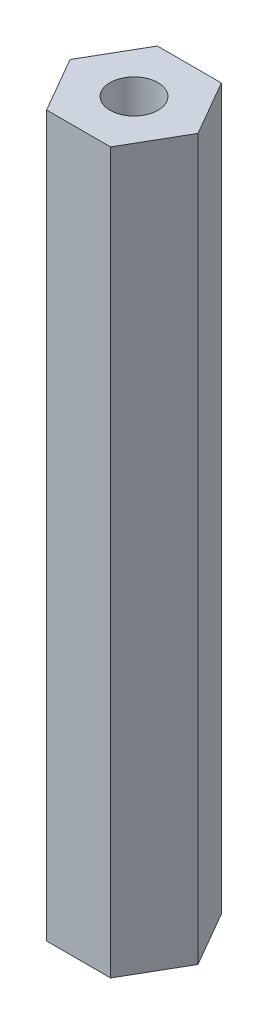
ISO-10303-21;
HEADER;
FILE_DESCRIPTION(('STEP AP214'),'2;1');
FILE_NAME('part.step','',(''),(''),'','','');
FILE_SCHEMA(('AUTOMOTIVE_DESIGN { 1 0 10303 214 1 1 1 1 }'));
ENDSEC;
DATA;
#1=APPLICATION_CONTEXT('core data for automotive mechanical design processes');
#2=APPLICATION_PROTOCOL_DEFINITION('international standard','automotive_design',2000,#1);
#3=PRODUCT_CONTEXT('',#1,'mechanical');
#4=PRODUCT('Part','Part','',(#3));
#5=PRODUCT_RELATED_PRODUCT_CATEGORY('part','',(#4));
#6=PRODUCT_DEFINITION_FORMATION('','',#4);
#7=PRODUCT_DEFINITION_CONTEXT('part definition',#1,'design');
#8=PRODUCT_DEFINITION('design','',#6,#7);
#9=PRODUCT_DEFINITION_SHAPE('','',#8);
#10=(LENGTH_UNIT() NAMED_UNIT(*) SI_UNIT(.MILLI.,.METRE.));
#11=(NAMED_UNIT(*) PLANE_ANGLE_UNIT() SI_UNIT($,.RADIAN.));
#12=(NAMED_UNIT(*) SI_UNIT($,.STERADIAN.) SOLID_ANGLE_UNIT());
#13=UNCERTAINTY_MEASURE_WITH_UNIT(LENGTH_MEASURE(1.E-05),#10,'distance_accuracy_value','');
#14=(GEOMETRIC_REPRESENTATION_CONTEXT(3) GLOBAL_UNCERTAINTY_ASSIGNED_CONTEXT((#13)) GLOBAL_UNIT_ASSIGNED_CONTEXT((#10,
#11,#12)) REPRESENTATION_CONTEXT('',''));
#15=CARTESIAN_POINT('',(0.,0.,0.));
#16=DIRECTION('',(0.,0.,1.));
#17=DIRECTION('',(1.,0.,0.));
#18=AXIS2_PLACEMENT_3D('',#15,#16,#17);
#19=CARTESIAN_POINT('',(2.,45.,3.46410161513776));
#20=DIRECTION('',(-0.866025403784439,0.,-0.5));
#21=DIRECTION('',(-0.5,0.,0.866025403784439));
#22=AXIS2_PLACEMENT_3D('',#19,#20,#21);
#23=PLANE('',#22);
#24=DIRECTION('',(0.5,0.,-0.866025403784439));
#25=VECTOR('',#24,1.);
#26=CARTESIAN_POINT('',(2.,0.,3.46410161513776));
#27=LINE('',#26,#25);
#28=CARTESIAN_POINT('',(2.,0.,3.46410161513776));
#29=VERTEX_POINT('',#28);
#30=CARTESIAN_POINT('',(4.,0.,0.));
#31=VERTEX_POINT('',#30);
#32=EDGE_CURVE('E117',#29,#31,#27,.T.);
#33=ORIENTED_EDGE('',*,*,#32,.T.);
#34=DIRECTION('',(0.,-1.,0.));
#35=VECTOR('',#34,1.);
#36=CARTESIAN_POINT('',(4.,45.,0.));
#37=LINE('',#36,#35);
#38=CARTESIAN_POINT('',(4.,45.,0.));
#39=VERTEX_POINT('',#38);
#40=EDGE_CURVE('E11',#39,#31,#37,.T.);
#41=ORIENTED_EDGE('',*,*,#40,.F.);
#42=DIRECTION('',(0.5,0.,-0.866025403784439));
#43=VECTOR('',#42,1.);
#44=CARTESIAN_POINT('',(2.,45.,3.46410161513776));
#45=LINE('',#44,#43);
#46=CARTESIAN_POINT('',(2.,45.,3.46410161513776));
#47=VERTEX_POINT('',#46);
#48=EDGE_CURVE('E128',#47,#39,#45,.T.);
#49=ORIENTED_EDGE('',*,*,#48,.F.);
#50=DIRECTION('',(0.,-1.,0.));
#51=VECTOR('',#50,1.);
#52=CARTESIAN_POINT('',(2.,45.,3.46410161513776));
#53=LINE('',#52,#51);
#54=EDGE_CURVE('E113',#47,#29,#53,.T.);
#55=ORIENTED_EDGE('',*,*,#54,.T.);
#56=EDGE_LOOP('',(#33,#41,#49,#55));
#57=FACE_BOUND('',#56,.T.);
#58=ADVANCED_FACE('F33',(#57),#23,.F.);
#59=CARTESIAN_POINT('',(4.,45.,0.));
#60=DIRECTION('',(-0.866025403784439,0.,0.5));
#61=DIRECTION('',(0.5,0.,0.866025403784439));
#62=AXIS2_PLACEMENT_3D('',#59,#60,#61);
#63=PLANE('',#62);
#64=DIRECTION('',(-0.5,0.,-0.866025403784439));
#65=VECTOR('',#64,1.);
#66=CARTESIAN_POINT('',(4.,0.,0.));
#67=LINE('',#66,#65);
#68=CARTESIAN_POINT('',(2.,0.,-3.46410161513776));
#69=VERTEX_POINT('',#68);
#70=EDGE_CURVE('E120',#31,#69,#67,.T.);
#71=ORIENTED_EDGE('',*,*,#70,.T.);
#72=DIRECTION('',(0.,-1.,0.));
#73=VECTOR('',#72,1.);
#74=CARTESIAN_POINT('',(2.,45.,-3.46410161513776));
#75=LINE('',#74,#73);
#76=CARTESIAN_POINT('',(2.,45.,-3.46410161513776));
#77=VERTEX_POINT('',#76);
#78=EDGE_CURVE('E41',#77,#69,#75,.T.);
#79=ORIENTED_EDGE('',*,*,#78,.F.);
#80=DIRECTION('',(-0.5,0.,-0.866025403784439));
#81=VECTOR('',#80,1.);
#82=CARTESIAN_POINT('',(4.,45.,0.));
#83=LINE('',#82,#81);
#84=EDGE_CURVE('E86',#39,#77,#83,.T.);
#85=ORIENTED_EDGE('',*,*,#84,.F.);
#86=ORIENTED_EDGE('',*,*,#40,.T.);
#87=EDGE_LOOP('',(#71,#79,#85,#86));
#88=FACE_BOUND('',#87,.T.);
#89=ADVANCED_FACE('F153',(#88),#63,.F.);
#90=CARTESIAN_POINT('',(2.,45.,-3.46410161513776));
#91=DIRECTION('',(0.,0.,1.));
#92=DIRECTION('',(1.,0.,0.));
#93=AXIS2_PLACEMENT_3D('',#90,#91,#92);
#94=PLANE('',#93);
#95=DIRECTION('',(-1.,0.,0.));
#96=VECTOR('',#95,1.);
#97=CARTESIAN_POINT('',(2.,0.,-3.46410161513776));
#98=LINE('',#97,#96);
#99=CARTESIAN_POINT('',(-2.,0.,-3.46410161513776));
#100=VERTEX_POINT('',#99);
#101=EDGE_CURVE('E123',#69,#100,#98,.T.);
#102=ORIENTED_EDGE('',*,*,#101,.T.);
#103=DIRECTION('',(0.,-1.,0.));
#104=VECTOR('',#103,1.);
#105=CARTESIAN_POINT('',(-2.,45.,-3.46410161513776));
#106=LINE('',#105,#104);
#107=CARTESIAN_POINT('',(-2.,45.,-3.46410161513776));
#108=VERTEX_POINT('',#107);
#109=EDGE_CURVE('E108',#108,#100,#106,.T.);
#110=ORIENTED_EDGE('',*,*,#109,.F.);
#111=DIRECTION('',(-1.,0.,0.));
#112=VECTOR('',#111,1.);
#113=CARTESIAN_POINT('',(2.,45.,-3.46410161513776));
#114=LINE('',#113,#112);
#115=EDGE_CURVE('E99',#77,#108,#114,.T.);
#116=ORIENTED_EDGE('',*,*,#115,.F.);
#117=ORIENTED_EDGE('',*,*,#78,.T.);
#118=EDGE_LOOP('',(#102,#110,#116,#117));
#119=FACE_BOUND('',#118,.T.);
#120=ADVANCED_FACE('F134',(#119),#94,.F.);
#121=CARTESIAN_POINT('',(-2.,45.,-3.46410161513776));
#122=DIRECTION('',(0.866025403784439,0.,0.5));
#123=DIRECTION('',(0.5,0.,-0.866025403784439));
#124=AXIS2_PLACEMENT_3D('',#121,#122,#123);
#125=PLANE('',#124);
#126=DIRECTION('',(-0.5,0.,0.866025403784439));
#127=VECTOR('',#126,1.);
#128=CARTESIAN_POINT('',(-2.,0.,-3.46410161513776));
#129=LINE('',#128,#127);
#130=CARTESIAN_POINT('',(-4.,0.,0.));
#131=VERTEX_POINT('',#130);
#132=EDGE_CURVE('E107',#100,#131,#129,.T.);
#133=ORIENTED_EDGE('',*,*,#132,.T.);
#134=DIRECTION('',(0.,-1.,0.));
#135=VECTOR('',#134,1.);
#136=CARTESIAN_POINT('',(-4.,45.,0.));
#137=LINE('',#136,#135);
#138=CARTESIAN_POINT('',(-4.,45.,0.));
#139=VERTEX_POINT('',#138);
#140=EDGE_CURVE('E104',#139,#131,#137,.T.);
#141=ORIENTED_EDGE('',*,*,#140,.F.);
#142=DIRECTION('',(-0.5,0.,0.866025403784439));
#143=VECTOR('',#142,1.);
#144=CARTESIAN_POINT('',(-2.,45.,-3.46410161513776));
#145=LINE('',#144,#143);
#146=EDGE_CURVE('E93',#108,#139,#145,.T.);
#147=ORIENTED_EDGE('',*,*,#146,.F.);
#148=ORIENTED_EDGE('',*,*,#109,.T.);
#149=EDGE_LOOP('',(#133,#141,#147,#148));
#150=FACE_BOUND('',#149,.T.);
#151=ADVANCED_FACE('F105',(#150),#125,.F.);
#152=CARTESIAN_POINT('',(-4.,45.,0.));
#153=DIRECTION('',(0.866025403784438,0.,-0.5));
#154=DIRECTION('',(-0.5,0.,-0.866025403784439));
#155=AXIS2_PLACEMENT_3D('',#152,#153,#154);
#156=PLANE('',#155);
#157=DIRECTION('',(0.5,0.,0.866025403784438));
#158=VECTOR('',#157,1.);
#159=CARTESIAN_POINT('',(-4.,0.,0.));
#160=LINE('',#159,#158);
#161=CARTESIAN_POINT('',(-2.,0.,3.46410161513776));
#162=VERTEX_POINT('',#161);
#163=EDGE_CURVE('E72',#131,#162,#160,.T.);
#164=ORIENTED_EDGE('',*,*,#163,.T.);
#165=DIRECTION('',(0.,-1.,0.));
#166=VECTOR('',#165,1.);
#167=CARTESIAN_POINT('',(-2.,45.,3.46410161513776));
#168=LINE('',#167,#166);
#169=CARTESIAN_POINT('',(-2.,45.,3.46410161513776));
#170=VERTEX_POINT('',#169);
#171=EDGE_CURVE('E109',#170,#162,#168,.T.);
#172=ORIENTED_EDGE('',*,*,#171,.F.);
#173=DIRECTION('',(0.5,0.,0.866025403784438));
#174=VECTOR('',#173,1.);
#175=CARTESIAN_POINT('',(-4.,45.,0.));
#176=LINE('',#175,#174);
#177=EDGE_CURVE('E97',#139,#170,#176,.T.);
#178=ORIENTED_EDGE('',*,*,#177,.F.);
#179=ORIENTED_EDGE('',*,*,#140,.T.);
#180=EDGE_LOOP('',(#164,#172,#178,#179));
#181=FACE_BOUND('',#180,.T.);
#182=ADVANCED_FACE('F111',(#181),#156,.F.);
#183=CARTESIAN_POINT('',(-2.,45.,3.46410161513776));
#184=DIRECTION('',(0.,0.,-1.));
#185=DIRECTION('',(-1.,0.,0.));
#186=AXIS2_PLACEMENT_3D('',#183,#184,#185);
#187=PLANE('',#186);
#188=DIRECTION('',(1.,0.,0.));
#189=VECTOR('',#188,1.);
#190=CARTESIAN_POINT('',(-2.,0.,3.46410161513776));
#191=LINE('',#190,#189);
#192=EDGE_CURVE('E78',#162,#29,#191,.T.);
#193=ORIENTED_EDGE('',*,*,#192,.T.);
#194=ORIENTED_EDGE('',*,*,#54,.F.);
#195=DIRECTION('',(1.,0.,0.));
#196=VECTOR('',#195,1.);
#197=CARTESIAN_POINT('',(-2.,45.,3.46410161513776));
#198=LINE('',#197,#196);
#199=EDGE_CURVE('E49',#170,#47,#198,.T.);
#200=ORIENTED_EDGE('',*,*,#199,.F.);
#201=ORIENTED_EDGE('',*,*,#171,.T.);
#202=EDGE_LOOP('',(#193,#194,#200,#201));
#203=FACE_BOUND('',#202,.T.);
#204=ADVANCED_FACE('F141',(#203),#187,.F.);
#205=CARTESIAN_POINT('',(0.,45.,0.));
#206=DIRECTION('',(0.,1.,0.));
#207=DIRECTION('',(0.,0.,1.));
#208=AXIS2_PLACEMENT_3D('',#205,#206,#207);
#209=PLANE('',#208);
#210=CARTESIAN_POINT('',(0.,45.,0.));
#211=DIRECTION('',(0.,1.,0.));
#212=DIRECTION('',(0.,0.,1.));
#213=AXIS2_PLACEMENT_3D('',#210,#211,#212);
#214=CIRCLE('',#213,1.5);
#215=CARTESIAN_POINT('',(0.,45.,1.5));
#216=VERTEX_POINT('',#215);
#217=EDGE_CURVE('E240',#216,#216,#214,.T.);
#218=ORIENTED_EDGE('',*,*,#217,.F.);
#219=EDGE_LOOP('',(#218));
#220=FACE_BOUND('',#219,.T.);
#221=ORIENTED_EDGE('',*,*,#48,.T.);
#222=ORIENTED_EDGE('',*,*,#84,.T.);
#223=ORIENTED_EDGE('',*,*,#115,.T.);
#224=ORIENTED_EDGE('',*,*,#146,.T.);
#225=ORIENTED_EDGE('',*,*,#177,.T.);
#226=ORIENTED_EDGE('',*,*,#199,.T.);
#227=EDGE_LOOP('',(#221,#222,#223,#224,#225,#226));
#228=FACE_BOUND('',#227,.T.);
#229=ADVANCED_FACE('F95',(#220,#228),#209,.T.);
#230=CARTESIAN_POINT('',(0.,0.,0.));
#231=DIRECTION('',(0.,1.,0.));
#232=DIRECTION('',(0.,0.,1.));
#233=AXIS2_PLACEMENT_3D('',#230,#231,#232);
#234=PLANE('',#233);
#235=CARTESIAN_POINT('',(0.,0.,0.));
#236=DIRECTION('',(0.,1.,0.));
#237=DIRECTION('',(0.,0.,1.));
#238=AXIS2_PLACEMENT_3D('',#235,#236,#237);
#239=CIRCLE('',#238,1.5);
#240=CARTESIAN_POINT('',(0.,0.,1.5));
#241=VERTEX_POINT('',#240);
#242=EDGE_CURVE('E237',#241,#241,#239,.T.);
#243=ORIENTED_EDGE('',*,*,#242,.T.);
#244=EDGE_LOOP('',(#243));
#245=FACE_BOUND('',#244,.T.);
#246=ORIENTED_EDGE('',*,*,#32,.F.);
#247=ORIENTED_EDGE('',*,*,#192,.F.);
#248=ORIENTED_EDGE('',*,*,#163,.F.);
#249=ORIENTED_EDGE('',*,*,#132,.F.);
#250=ORIENTED_EDGE('',*,*,#101,.F.);
#251=ORIENTED_EDGE('',*,*,#70,.F.);
#252=EDGE_LOOP('',(#246,#247,#248,#249,#250,#251));
#253=FACE_BOUND('',#252,.T.);
#254=ADVANCED_FACE('F137',(#245,#253),#234,.F.);
#255=CARTESIAN_POINT('',(0.,40.,0.));
#256=DIRECTION('',(0.,1.,0.));
#257=DIRECTION('',(0.,0.,1.));
#258=AXIS2_PLACEMENT_3D('',#255,#256,#257);
#259=CYLINDRICAL_SURFACE('',#258,1.5);
#260=CARTESIAN_POINT('',(0.,40.,0.));
#261=DIRECTION('',(0.,1.,0.));
#262=DIRECTION('',(0.,0.,1.));
#263=AXIS2_PLACEMENT_3D('',#260,#261,#262);
#264=CIRCLE('',#263,1.5);
#265=CARTESIAN_POINT('',(0.,40.,1.5));
#266=VERTEX_POINT('',#265);
#267=EDGE_CURVE('E121',#266,#266,#264,.T.);
#268=ORIENTED_EDGE('',*,*,#267,.F.);
#269=EDGE_LOOP('',(#268));
#270=FACE_BOUND('',#269,.T.);
#271=ORIENTED_EDGE('',*,*,#217,.T.);
#272=EDGE_LOOP('',(#271));
#273=FACE_BOUND('',#272,.T.);
#274=ADVANCED_FACE('F188',(#270,#273),#259,.F.);
#275=CARTESIAN_POINT('',(0.,40.,0.));
#276=DIRECTION('',(0.,1.,0.));
#277=DIRECTION('',(0.,0.,1.));
#278=AXIS2_PLACEMENT_3D('',#275,#276,#277);
#279=PLANE('',#278);
#280=ORIENTED_EDGE('',*,*,#267,.T.);
#281=EDGE_LOOP('',(#280));
#282=FACE_BOUND('',#281,.T.);
#283=ADVANCED_FACE('F193',(#282),#279,.T.);
#284=CARTESIAN_POINT('',(0.,0.,0.));
#285=DIRECTION('',(0.,1.,0.));
#286=DIRECTION('',(0.,0.,1.));
#287=AXIS2_PLACEMENT_3D('',#284,#285,#286);
#288=CYLINDRICAL_SURFACE('',#287,1.5);
#289=ORIENTED_EDGE('',*,*,#242,.F.);
#290=EDGE_LOOP('',(#289));
#291=FACE_BOUND('',#290,.T.);
#292=CARTESIAN_POINT('',(0.,5.,0.));
#293=DIRECTION('',(0.,1.,0.));
#294=DIRECTION('',(0.,0.,1.));
#295=AXIS2_PLACEMENT_3D('',#292,#293,#294);
#296=CIRCLE('',#295,1.5);
#297=CARTESIAN_POINT('',(0.,5.,1.5));
#298=VERTEX_POINT('',#297);
#299=EDGE_CURVE('E235',#298,#298,#296,.T.);
#300=ORIENTED_EDGE('',*,*,#299,.T.);
#301=EDGE_LOOP('',(#300));
#302=FACE_BOUND('',#301,.T.);
#303=ADVANCED_FACE('F203',(#291,#302),#288,.F.);
#304=CARTESIAN_POINT('',(0.,5.,0.));
#305=DIRECTION('',(0.,1.,0.));
#306=DIRECTION('',(0.,0.,1.));
#307=AXIS2_PLACEMENT_3D('',#304,#305,#306);
#308=PLANE('',#307);
#309=ORIENTED_EDGE('',*,*,#299,.F.);
#310=EDGE_LOOP('',(#309));
#311=FACE_BOUND('',#310,.T.);
#312=ADVANCED_FACE('F219',(#311),#308,.F.);
#313=CLOSED_SHELL('',(#58,#89,#120,#151,#182,#204,#229,#254,#274,#283,#303,#312));
#314=MANIFOLD_SOLID_BREP('B2',#313);
#315=ADVANCED_BREP_SHAPE_REPRESENTATION('',(#18,#314),#14);
#316=SHAPE_DEFINITION_REPRESENTATION(#9,#315);
ENDSEC;
END-ISO-10303-21;
